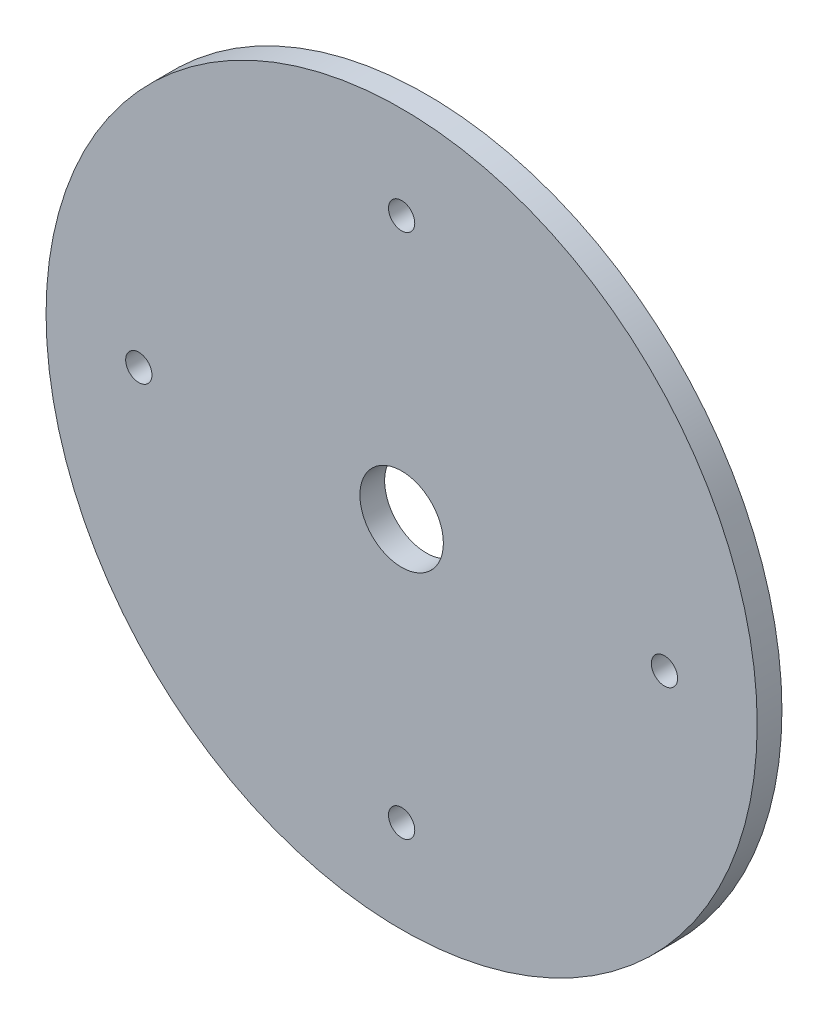
ISO-10303-21;
HEADER;
FILE_DESCRIPTION(('STEP AP214'),'2;1');
FILE_NAME('part.step','',(''),(''),'','','');
FILE_SCHEMA(('AUTOMOTIVE_DESIGN { 1 0 10303 214 1 1 1 1 }'));
ENDSEC;
DATA;
#1=APPLICATION_CONTEXT('core data for automotive mechanical design processes');
#2=APPLICATION_PROTOCOL_DEFINITION('international standard','automotive_design',2000,#1);
#3=PRODUCT_CONTEXT('',#1,'mechanical');
#4=PRODUCT('Part','Part','',(#3));
#5=PRODUCT_RELATED_PRODUCT_CATEGORY('part','',(#4));
#6=PRODUCT_DEFINITION_FORMATION('','',#4);
#7=PRODUCT_DEFINITION_CONTEXT('part definition',#1,'design');
#8=PRODUCT_DEFINITION('design','',#6,#7);
#9=PRODUCT_DEFINITION_SHAPE('','',#8);
#10=(LENGTH_UNIT() NAMED_UNIT(*) SI_UNIT(.MILLI.,.METRE.));
#11=(NAMED_UNIT(*) PLANE_ANGLE_UNIT() SI_UNIT($,.RADIAN.));
#12=(NAMED_UNIT(*) SI_UNIT($,.STERADIAN.) SOLID_ANGLE_UNIT());
#13=UNCERTAINTY_MEASURE_WITH_UNIT(LENGTH_MEASURE(1.E-05),#10,'distance_accuracy_value','');
#14=(GEOMETRIC_REPRESENTATION_CONTEXT(3) GLOBAL_UNCERTAINTY_ASSIGNED_CONTEXT((#13)) GLOBAL_UNIT_ASSIGNED_CONTEXT((#10,
#11,#12)) REPRESENTATION_CONTEXT('',''));
#15=CARTESIAN_POINT('',(0.,0.,0.));
#16=DIRECTION('',(0.,0.,1.));
#17=DIRECTION('',(1.,0.,0.));
#18=AXIS2_PLACEMENT_3D('',#15,#16,#17);
#19=CARTESIAN_POINT('',(300.,300.,470.));
#20=DIRECTION('',(0.,0.,-1.));
#21=DIRECTION('',(-1.,0.,0.));
#22=AXIS2_PLACEMENT_3D('',#19,#20,#21);
#23=CYLINDRICAL_SURFACE('',#22,115.);
#24=CARTESIAN_POINT('',(300.,300.,470.));
#25=DIRECTION('',(0.,0.,1.));
#26=DIRECTION('',(1.,0.,0.));
#27=AXIS2_PLACEMENT_3D('',#24,#25,#26);
#28=CIRCLE('',#27,115.);
#29=CARTESIAN_POINT('',(415.,300.,470.));
#30=VERTEX_POINT('',#29);
#31=EDGE_CURVE('E10',#30,#30,#28,.T.);
#32=ORIENTED_EDGE('',*,*,#31,.F.);
#33=EDGE_LOOP('',(#32));
#34=FACE_BOUND('',#33,.T.);
#35=CARTESIAN_POINT('',(300.,300.,462.));
#36=DIRECTION('',(0.,0.,1.));
#37=DIRECTION('',(1.,0.,0.));
#38=AXIS2_PLACEMENT_3D('',#35,#36,#37);
#39=CIRCLE('',#38,115.);
#40=CARTESIAN_POINT('',(415.,300.,462.));
#41=VERTEX_POINT('',#40);
#42=EDGE_CURVE('E42',#41,#41,#39,.T.);
#43=ORIENTED_EDGE('',*,*,#42,.T.);
#44=EDGE_LOOP('',(#43));
#45=FACE_BOUND('',#44,.T.);
#46=ADVANCED_FACE('F40',(#34,#45),#23,.T.);
#47=CARTESIAN_POINT('',(300.,300.,470.));
#48=DIRECTION('',(0.,0.,1.));
#49=DIRECTION('',(1.,0.,0.));
#50=AXIS2_PLACEMENT_3D('',#47,#48,#49);
#51=PLANE('',#50);
#52=CARTESIAN_POINT('',(300.,300.,470.));
#53=DIRECTION('',(0.,0.,1.));
#54=DIRECTION('',(1.,0.,0.));
#55=AXIS2_PLACEMENT_3D('',#52,#53,#54);
#56=CIRCLE('',#55,13.5);
#57=CARTESIAN_POINT('',(313.5,300.,470.));
#58=VERTEX_POINT('',#57);
#59=EDGE_CURVE('E79',#58,#58,#56,.T.);
#60=ORIENTED_EDGE('',*,*,#59,.F.);
#61=EDGE_LOOP('',(#60));
#62=FACE_BOUND('',#61,.T.);
#63=CARTESIAN_POINT('',(300.,215.,470.));
#64=DIRECTION('',(0.,0.,1.));
#65=DIRECTION('',(1.,0.,0.));
#66=AXIS2_PLACEMENT_3D('',#63,#64,#65);
#67=CIRCLE('',#66,4.24999999999995);
#68=CARTESIAN_POINT('',(304.25,215.,470.));
#69=VERTEX_POINT('',#68);
#70=EDGE_CURVE('E66',#69,#69,#67,.T.);
#71=ORIENTED_EDGE('',*,*,#70,.F.);
#72=EDGE_LOOP('',(#71));
#73=FACE_BOUND('',#72,.T.);
#74=CARTESIAN_POINT('',(300.,385.,470.));
#75=DIRECTION('',(0.,0.,1.));
#76=DIRECTION('',(1.,0.,0.));
#77=AXIS2_PLACEMENT_3D('',#74,#75,#76);
#78=CIRCLE('',#77,4.24999999999995);
#79=CARTESIAN_POINT('',(304.25,385.,470.));
#80=VERTEX_POINT('',#79);
#81=EDGE_CURVE('E65',#80,#80,#78,.T.);
#82=ORIENTED_EDGE('',*,*,#81,.F.);
#83=EDGE_LOOP('',(#82));
#84=FACE_BOUND('',#83,.T.);
#85=CARTESIAN_POINT('',(215.,300.,470.));
#86=DIRECTION('',(0.,0.,1.));
#87=DIRECTION('',(1.,0.,0.));
#88=AXIS2_PLACEMENT_3D('',#85,#86,#87);
#89=CIRCLE('',#88,4.25000000000001);
#90=CARTESIAN_POINT('',(219.25,300.,470.));
#91=VERTEX_POINT('',#90);
#92=EDGE_CURVE('E58',#91,#91,#89,.T.);
#93=ORIENTED_EDGE('',*,*,#92,.F.);
#94=EDGE_LOOP('',(#93));
#95=FACE_BOUND('',#94,.T.);
#96=CARTESIAN_POINT('',(385.,300.,470.));
#97=DIRECTION('',(0.,0.,1.));
#98=DIRECTION('',(1.,0.,0.));
#99=AXIS2_PLACEMENT_3D('',#96,#97,#98);
#100=CIRCLE('',#99,4.24999999999995);
#101=CARTESIAN_POINT('',(389.25,300.,470.));
#102=VERTEX_POINT('',#101);
#103=EDGE_CURVE('E55',#102,#102,#100,.T.);
#104=ORIENTED_EDGE('',*,*,#103,.F.);
#105=EDGE_LOOP('',(#104));
#106=FACE_BOUND('',#105,.T.);
#107=ORIENTED_EDGE('',*,*,#31,.T.);
#108=EDGE_LOOP('',(#107));
#109=FACE_BOUND('',#108,.T.);
#110=ADVANCED_FACE('F82',(#62,#73,#84,#95,#106,#109),#51,.T.);
#111=CARTESIAN_POINT('',(300.,300.,462.));
#112=DIRECTION('',(0.,0.,1.));
#113=DIRECTION('',(1.,0.,0.));
#114=AXIS2_PLACEMENT_3D('',#111,#112,#113);
#115=PLANE('',#114);
#116=CARTESIAN_POINT('',(300.,300.,462.));
#117=DIRECTION('',(0.,0.,1.));
#118=DIRECTION('',(1.,0.,0.));
#119=AXIS2_PLACEMENT_3D('',#116,#117,#118);
#120=CIRCLE('',#119,13.5);
#121=CARTESIAN_POINT('',(313.5,300.,462.));
#122=VERTEX_POINT('',#121);
#123=EDGE_CURVE('E37',#122,#122,#120,.T.);
#124=ORIENTED_EDGE('',*,*,#123,.T.);
#125=EDGE_LOOP('',(#124));
#126=FACE_BOUND('',#125,.T.);
#127=CARTESIAN_POINT('',(300.,215.,462.));
#128=DIRECTION('',(0.,0.,1.));
#129=DIRECTION('',(1.,0.,0.));
#130=AXIS2_PLACEMENT_3D('',#127,#128,#129);
#131=CIRCLE('',#130,4.24999999999995);
#132=CARTESIAN_POINT('',(304.25,215.,462.));
#133=VERTEX_POINT('',#132);
#134=EDGE_CURVE('E63',#133,#133,#131,.T.);
#135=ORIENTED_EDGE('',*,*,#134,.T.);
#136=EDGE_LOOP('',(#135));
#137=FACE_BOUND('',#136,.T.);
#138=CARTESIAN_POINT('',(300.,385.,462.));
#139=DIRECTION('',(0.,0.,1.));
#140=DIRECTION('',(1.,0.,0.));
#141=AXIS2_PLACEMENT_3D('',#138,#139,#140);
#142=CIRCLE('',#141,4.24999999999995);
#143=CARTESIAN_POINT('',(304.25,385.,462.));
#144=VERTEX_POINT('',#143);
#145=EDGE_CURVE('E64',#144,#144,#142,.T.);
#146=ORIENTED_EDGE('',*,*,#145,.T.);
#147=EDGE_LOOP('',(#146));
#148=FACE_BOUND('',#147,.T.);
#149=CARTESIAN_POINT('',(215.,300.,462.));
#150=DIRECTION('',(0.,0.,1.));
#151=DIRECTION('',(1.,0.,0.));
#152=AXIS2_PLACEMENT_3D('',#149,#150,#151);
#153=CIRCLE('',#152,4.25000000000001);
#154=CARTESIAN_POINT('',(219.25,300.,462.));
#155=VERTEX_POINT('',#154);
#156=EDGE_CURVE('E60',#155,#155,#153,.T.);
#157=ORIENTED_EDGE('',*,*,#156,.T.);
#158=EDGE_LOOP('',(#157));
#159=FACE_BOUND('',#158,.T.);
#160=CARTESIAN_POINT('',(385.,300.,462.));
#161=DIRECTION('',(0.,0.,1.));
#162=DIRECTION('',(1.,0.,0.));
#163=AXIS2_PLACEMENT_3D('',#160,#161,#162);
#164=CIRCLE('',#163,4.24999999999995);
#165=CARTESIAN_POINT('',(389.25,300.,462.));
#166=VERTEX_POINT('',#165);
#167=EDGE_CURVE('E47',#166,#166,#164,.T.);
#168=ORIENTED_EDGE('',*,*,#167,.T.);
#169=EDGE_LOOP('',(#168));
#170=FACE_BOUND('',#169,.T.);
#171=ORIENTED_EDGE('',*,*,#42,.F.);
#172=EDGE_LOOP('',(#171));
#173=FACE_BOUND('',#172,.T.);
#174=ADVANCED_FACE('F87',(#126,#137,#148,#159,#170,#173),#115,.F.);
#175=CARTESIAN_POINT('',(385.,300.,442.));
#176=DIRECTION('',(0.,0.,1.));
#177=DIRECTION('',(1.,0.,0.));
#178=AXIS2_PLACEMENT_3D('',#175,#176,#177);
#179=CYLINDRICAL_SURFACE('',#178,4.24999999999995);
#180=ORIENTED_EDGE('',*,*,#103,.T.);
#181=EDGE_LOOP('',(#180));
#182=FACE_BOUND('',#181,.T.);
#183=ORIENTED_EDGE('',*,*,#167,.F.);
#184=EDGE_LOOP('',(#183));
#185=FACE_BOUND('',#184,.T.);
#186=ADVANCED_FACE('F91',(#182,#185),#179,.F.);
#187=CARTESIAN_POINT('',(215.,300.,442.));
#188=DIRECTION('',(0.,0.,1.));
#189=DIRECTION('',(1.,0.,0.));
#190=AXIS2_PLACEMENT_3D('',#187,#188,#189);
#191=CYLINDRICAL_SURFACE('',#190,4.25000000000001);
#192=ORIENTED_EDGE('',*,*,#92,.T.);
#193=EDGE_LOOP('',(#192));
#194=FACE_BOUND('',#193,.T.);
#195=ORIENTED_EDGE('',*,*,#156,.F.);
#196=EDGE_LOOP('',(#195));
#197=FACE_BOUND('',#196,.T.);
#198=ADVANCED_FACE('F81',(#194,#197),#191,.F.);
#199=CARTESIAN_POINT('',(300.,385.,442.));
#200=DIRECTION('',(0.,0.,1.));
#201=DIRECTION('',(1.,0.,0.));
#202=AXIS2_PLACEMENT_3D('',#199,#200,#201);
#203=CYLINDRICAL_SURFACE('',#202,4.24999999999995);
#204=ORIENTED_EDGE('',*,*,#81,.T.);
#205=EDGE_LOOP('',(#204));
#206=FACE_BOUND('',#205,.T.);
#207=ORIENTED_EDGE('',*,*,#145,.F.);
#208=EDGE_LOOP('',(#207));
#209=FACE_BOUND('',#208,.T.);
#210=ADVANCED_FACE('F125',(#206,#209),#203,.F.);
#211=CARTESIAN_POINT('',(300.,215.,442.));
#212=DIRECTION('',(0.,0.,1.));
#213=DIRECTION('',(1.,0.,0.));
#214=AXIS2_PLACEMENT_3D('',#211,#212,#213);
#215=CYLINDRICAL_SURFACE('',#214,4.24999999999995);
#216=ORIENTED_EDGE('',*,*,#70,.T.);
#217=EDGE_LOOP('',(#216));
#218=FACE_BOUND('',#217,.T.);
#219=ORIENTED_EDGE('',*,*,#134,.F.);
#220=EDGE_LOOP('',(#219));
#221=FACE_BOUND('',#220,.T.);
#222=ADVANCED_FACE('F128',(#218,#221),#215,.F.);
#223=CARTESIAN_POINT('',(300.,300.,442.));
#224=DIRECTION('',(0.,0.,1.));
#225=DIRECTION('',(1.,0.,0.));
#226=AXIS2_PLACEMENT_3D('',#223,#224,#225);
#227=CYLINDRICAL_SURFACE('',#226,13.5);
#228=ORIENTED_EDGE('',*,*,#59,.T.);
#229=EDGE_LOOP('',(#228));
#230=FACE_BOUND('',#229,.T.);
#231=ORIENTED_EDGE('',*,*,#123,.F.);
#232=EDGE_LOOP('',(#231));
#233=FACE_BOUND('',#232,.T.);
#234=ADVANCED_FACE('F138',(#230,#233),#227,.F.);
#235=CLOSED_SHELL('',(#46,#110,#174,#186,#198,#210,#222,#234));
#236=MANIFOLD_SOLID_BREP('B2',#235);
#237=ADVANCED_BREP_SHAPE_REPRESENTATION('',(#18,#236),#14);
#238=SHAPE_DEFINITION_REPRESENTATION(#9,#237);
ENDSEC;
END-ISO-10303-21;
